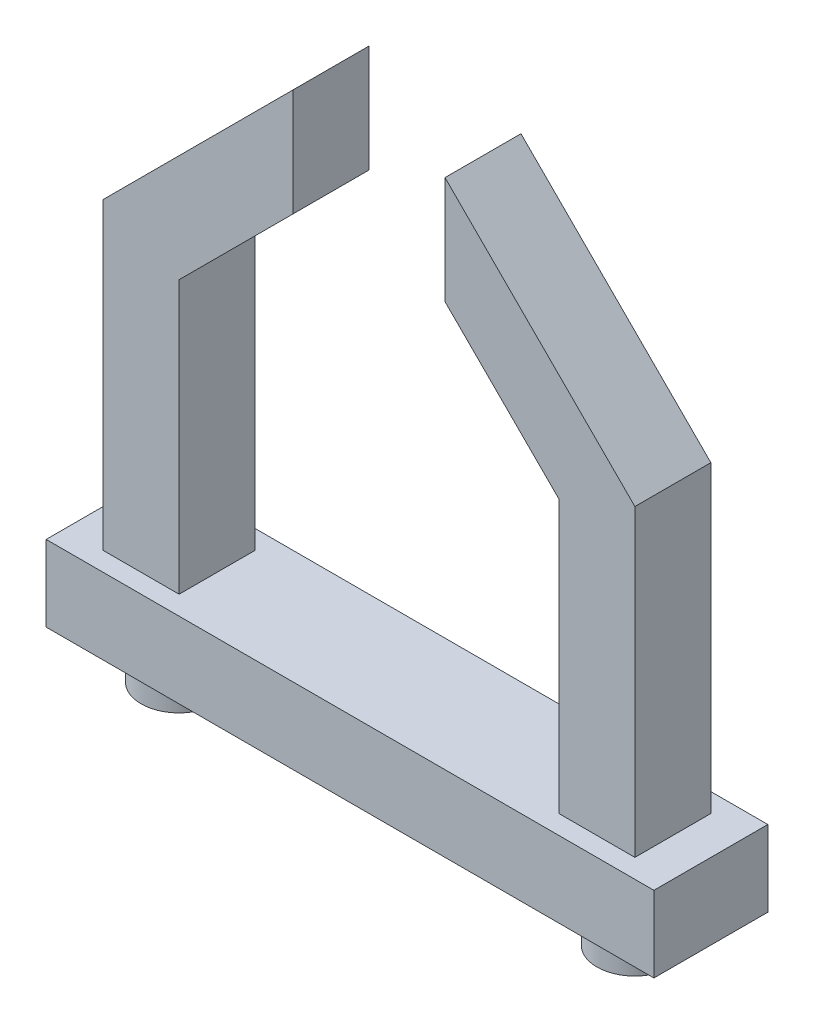
ISO-10303-21;
HEADER;
FILE_DESCRIPTION(('STEP AP214'),'2;1');
FILE_NAME('part.step','',(''),(''),'','','');
FILE_SCHEMA(('AUTOMOTIVE_DESIGN { 1 0 10303 214 1 1 1 1 }'));
ENDSEC;
DATA;
#1=APPLICATION_CONTEXT('core data for automotive mechanical design processes');
#2=APPLICATION_PROTOCOL_DEFINITION('international standard','automotive_design',2000,#1);
#3=PRODUCT_CONTEXT('',#1,'mechanical');
#4=PRODUCT('Part','Part','',(#3));
#5=PRODUCT_RELATED_PRODUCT_CATEGORY('part','',(#4));
#6=PRODUCT_DEFINITION_FORMATION('','',#4);
#7=PRODUCT_DEFINITION_CONTEXT('part definition',#1,'design');
#8=PRODUCT_DEFINITION('design','',#6,#7);
#9=PRODUCT_DEFINITION_SHAPE('','',#8);
#10=(LENGTH_UNIT() NAMED_UNIT(*) SI_UNIT(.MILLI.,.METRE.));
#11=(NAMED_UNIT(*) PLANE_ANGLE_UNIT() SI_UNIT($,.RADIAN.));
#12=(NAMED_UNIT(*) SI_UNIT($,.STERADIAN.) SOLID_ANGLE_UNIT());
#13=UNCERTAINTY_MEASURE_WITH_UNIT(LENGTH_MEASURE(1.E-05),#10,'distance_accuracy_value','');
#14=(GEOMETRIC_REPRESENTATION_CONTEXT(3) GLOBAL_UNCERTAINTY_ASSIGNED_CONTEXT((#13)) GLOBAL_UNIT_ASSIGNED_CONTEXT((#10,
#11,#12)) REPRESENTATION_CONTEXT('',''));
#15=CARTESIAN_POINT('',(0.,0.,0.));
#16=DIRECTION('',(0.,0.,1.));
#17=DIRECTION('',(1.,0.,0.));
#18=AXIS2_PLACEMENT_3D('',#15,#16,#17);
#19=CARTESIAN_POINT('',(-21.25,21.25,2.5));
#20=DIRECTION('',(-0.707106781186546,0.707106781186549,0.));
#21=DIRECTION('',(-0.707106781186549,-0.707106781186546,0.));
#22=AXIS2_PLACEMENT_3D('',#19,#20,#21);
#23=PLANE('',#22);
#24=DIRECTION('',(0.707106781186549,0.707106781186546,0.));
#25=VECTOR('',#24,1.);
#26=CARTESIAN_POINT('',(-21.25,21.25,-2.5));
#27=LINE('',#26,#25);
#28=CARTESIAN_POINT('',(-17.5,25.,-2.5));
#29=VERTEX_POINT('',#28);
#30=CARTESIAN_POINT('',(-5.,37.5,-2.5));
#31=VERTEX_POINT('',#30);
#32=EDGE_CURVE('E133',#29,#31,#27,.T.);
#33=ORIENTED_EDGE('',*,*,#32,.F.);
#34=DIRECTION('',(0.,0.,-1.));
#35=VECTOR('',#34,1.);
#36=CARTESIAN_POINT('',(-17.5,25.,2.5));
#37=LINE('',#36,#35);
#38=CARTESIAN_POINT('',(-17.5,25.,2.5));
#39=VERTEX_POINT('',#38);
#40=EDGE_CURVE('E55',#39,#29,#37,.T.);
#41=ORIENTED_EDGE('',*,*,#40,.F.);
#42=DIRECTION('',(0.707106781186549,0.707106781186546,0.));
#43=VECTOR('',#42,1.);
#44=CARTESIAN_POINT('',(-21.25,21.25,2.5));
#45=LINE('',#44,#43);
#46=CARTESIAN_POINT('',(-5.,37.5,2.5));
#47=VERTEX_POINT('',#46);
#48=EDGE_CURVE('E154',#39,#47,#45,.T.);
#49=ORIENTED_EDGE('',*,*,#48,.T.);
#50=DIRECTION('',(0.,0.,-1.));
#51=VECTOR('',#50,1.);
#52=CARTESIAN_POINT('',(-5.,37.5,2.5));
#53=LINE('',#52,#51);
#54=EDGE_CURVE('E63',#47,#31,#53,.T.);
#55=ORIENTED_EDGE('',*,*,#54,.T.);
#56=EDGE_LOOP('',(#33,#41,#49,#55));
#57=FACE_BOUND('',#56,.T.);
#58=ADVANCED_FACE('F46',(#57),#23,.T.);
#59=CARTESIAN_POINT('',(-17.5,0.,2.5));
#60=DIRECTION('',(1.,0.,0.));
#61=DIRECTION('',(0.,1.,0.));
#62=AXIS2_PLACEMENT_3D('',#59,#60,#61);
#63=PLANE('',#62);
#64=DIRECTION('',(0.,-1.,0.));
#65=VECTOR('',#64,1.);
#66=CARTESIAN_POINT('',(-17.5,0.,-2.5));
#67=LINE('',#66,#65);
#68=CARTESIAN_POINT('',(-17.5,5.,-2.5));
#69=VERTEX_POINT('',#68);
#70=EDGE_CURVE('E136',#29,#69,#67,.T.);
#71=ORIENTED_EDGE('',*,*,#70,.T.);
#72=DIRECTION('',(0.,0.,-1.));
#73=VECTOR('',#72,1.);
#74=CARTESIAN_POINT('',(-17.5,5.,2.5));
#75=LINE('',#74,#73);
#76=CARTESIAN_POINT('',(-17.5,5.,2.5));
#77=VERTEX_POINT('',#76);
#78=EDGE_CURVE('E161',#77,#69,#75,.T.);
#79=ORIENTED_EDGE('',*,*,#78,.F.);
#80=DIRECTION('',(0.,-1.,0.));
#81=VECTOR('',#80,1.);
#82=CARTESIAN_POINT('',(-17.5,0.,2.5));
#83=LINE('',#82,#81);
#84=EDGE_CURVE('E169',#39,#77,#83,.T.);
#85=ORIENTED_EDGE('',*,*,#84,.F.);
#86=ORIENTED_EDGE('',*,*,#40,.T.);
#87=EDGE_LOOP('',(#71,#79,#85,#86));
#88=FACE_BOUND('',#87,.T.);
#89=ADVANCED_FACE('F167',(#88),#63,.F.);
#90=CARTESIAN_POINT('',(-12.5,0.,2.5));
#91=DIRECTION('',(1.,0.,0.));
#92=DIRECTION('',(0.,1.,0.));
#93=AXIS2_PLACEMENT_3D('',#90,#91,#92);
#94=PLANE('',#93);
#95=DIRECTION('',(0.,-1.,0.));
#96=VECTOR('',#95,1.);
#97=CARTESIAN_POINT('',(-12.5,0.,-2.5));
#98=LINE('',#97,#96);
#99=CARTESIAN_POINT('',(-12.5,22.9289321881345,-2.5));
#100=VERTEX_POINT('',#99);
#101=CARTESIAN_POINT('',(-12.5,5.,-2.5));
#102=VERTEX_POINT('',#101);
#103=EDGE_CURVE('E108',#100,#102,#98,.T.);
#104=ORIENTED_EDGE('',*,*,#103,.F.);
#105=DIRECTION('',(0.,0.,-1.));
#106=VECTOR('',#105,1.);
#107=CARTESIAN_POINT('',(-12.5,22.9289321881345,2.5));
#108=LINE('',#107,#106);
#109=CARTESIAN_POINT('',(-12.5,22.9289321881345,2.5));
#110=VERTEX_POINT('',#109);
#111=EDGE_CURVE('E102',#110,#100,#108,.T.);
#112=ORIENTED_EDGE('',*,*,#111,.F.);
#113=DIRECTION('',(0.,-1.,0.));
#114=VECTOR('',#113,1.);
#115=CARTESIAN_POINT('',(-12.5,0.,2.5));
#116=LINE('',#115,#114);
#117=CARTESIAN_POINT('',(-12.5,5.,2.5));
#118=VERTEX_POINT('',#117);
#119=EDGE_CURVE('E105',#110,#118,#116,.T.);
#120=ORIENTED_EDGE('',*,*,#119,.T.);
#121=DIRECTION('',(0.,0.,-1.));
#122=VECTOR('',#121,1.);
#123=CARTESIAN_POINT('',(-12.5,5.,2.5));
#124=LINE('',#123,#122);
#125=EDGE_CURVE('E113',#118,#102,#124,.T.);
#126=ORIENTED_EDGE('',*,*,#125,.T.);
#127=EDGE_LOOP('',(#104,#112,#120,#126));
#128=FACE_BOUND('',#127,.T.);
#129=ADVANCED_FACE('F104',(#128),#94,.T.);
#130=CARTESIAN_POINT('',(-17.7144660940672,17.7144660940673,2.5));
#131=DIRECTION('',(0.707106781186546,-0.707106781186549,0.));
#132=DIRECTION('',(0.707106781186549,0.707106781186546,0.));
#133=AXIS2_PLACEMENT_3D('',#130,#131,#132);
#134=PLANE('',#133);
#135=DIRECTION('',(-0.707106781186549,-0.707106781186546,0.));
#136=VECTOR('',#135,1.);
#137=CARTESIAN_POINT('',(-17.7144660940672,17.7144660940673,-2.5));
#138=LINE('',#137,#136);
#139=CARTESIAN_POINT('',(-5.,30.4289321881345,-2.5));
#140=VERTEX_POINT('',#139);
#141=EDGE_CURVE('E147',#140,#100,#138,.T.);
#142=ORIENTED_EDGE('',*,*,#141,.F.);
#143=DIRECTION('',(0.,0.,-1.));
#144=VECTOR('',#143,1.);
#145=CARTESIAN_POINT('',(-5.,30.4289321881345,2.5));
#146=LINE('',#145,#144);
#147=CARTESIAN_POINT('',(-5.,30.4289321881345,2.5));
#148=VERTEX_POINT('',#147);
#149=EDGE_CURVE('E81',#148,#140,#146,.T.);
#150=ORIENTED_EDGE('',*,*,#149,.F.);
#151=DIRECTION('',(-0.707106781186549,-0.707106781186546,0.));
#152=VECTOR('',#151,1.);
#153=CARTESIAN_POINT('',(-17.7144660940672,17.7144660940673,2.5));
#154=LINE('',#153,#152);
#155=EDGE_CURVE('E120',#148,#110,#154,.T.);
#156=ORIENTED_EDGE('',*,*,#155,.T.);
#157=ORIENTED_EDGE('',*,*,#111,.T.);
#158=EDGE_LOOP('',(#142,#150,#156,#157));
#159=FACE_BOUND('',#158,.T.);
#160=ADVANCED_FACE('F125',(#159),#134,.T.);
#161=CARTESIAN_POINT('',(-4.99999999999998,0.,2.5));
#162=DIRECTION('',(1.,0.,0.));
#163=DIRECTION('',(0.,1.,0.));
#164=AXIS2_PLACEMENT_3D('',#161,#162,#163);
#165=PLANE('',#164);
#166=DIRECTION('',(0.,-1.,0.));
#167=VECTOR('',#166,1.);
#168=CARTESIAN_POINT('',(-4.99999999999998,0.,-2.5));
#169=LINE('',#168,#167);
#170=EDGE_CURVE('E150',#31,#140,#169,.T.);
#171=ORIENTED_EDGE('',*,*,#170,.F.);
#172=ORIENTED_EDGE('',*,*,#54,.F.);
#173=DIRECTION('',(0.,-1.,0.));
#174=VECTOR('',#173,1.);
#175=CARTESIAN_POINT('',(-4.99999999999998,0.,2.5));
#176=LINE('',#175,#174);
#177=EDGE_CURVE('E127',#47,#148,#176,.T.);
#178=ORIENTED_EDGE('',*,*,#177,.T.);
#179=ORIENTED_EDGE('',*,*,#149,.T.);
#180=EDGE_LOOP('',(#171,#172,#178,#179));
#181=FACE_BOUND('',#180,.T.);
#182=ADVANCED_FACE('F185',(#181),#165,.T.);
#183=CARTESIAN_POINT('',(0.,0.,2.5));
#184=DIRECTION('',(0.,0.,1.));
#185=DIRECTION('',(1.,0.,0.));
#186=AXIS2_PLACEMENT_3D('',#183,#184,#185);
#187=PLANE('',#186);
#188=ORIENTED_EDGE('',*,*,#48,.F.);
#189=ORIENTED_EDGE('',*,*,#84,.T.);
#190=DIRECTION('',(-1.,0.,0.));
#191=VECTOR('',#190,1.);
#192=CARTESIAN_POINT('',(0.,5.,2.5));
#193=LINE('',#192,#191);
#194=EDGE_CURVE('E122',#118,#77,#193,.T.);
#195=ORIENTED_EDGE('',*,*,#194,.F.);
#196=ORIENTED_EDGE('',*,*,#119,.F.);
#197=ORIENTED_EDGE('',*,*,#155,.F.);
#198=ORIENTED_EDGE('',*,*,#177,.F.);
#199=EDGE_LOOP('',(#188,#189,#195,#196,#197,#198));
#200=FACE_BOUND('',#199,.T.);
#201=ADVANCED_FACE('F118',(#200),#187,.T.);
#202=CARTESIAN_POINT('',(0.,0.,-2.5));
#203=DIRECTION('',(0.,0.,1.));
#204=DIRECTION('',(1.,0.,0.));
#205=AXIS2_PLACEMENT_3D('',#202,#203,#204);
#206=PLANE('',#205);
#207=ORIENTED_EDGE('',*,*,#32,.T.);
#208=ORIENTED_EDGE('',*,*,#170,.T.);
#209=ORIENTED_EDGE('',*,*,#141,.T.);
#210=ORIENTED_EDGE('',*,*,#103,.T.);
#211=DIRECTION('',(-1.,0.,0.));
#212=VECTOR('',#211,1.);
#213=CARTESIAN_POINT('',(0.,5.,-2.5));
#214=LINE('',#213,#212);
#215=EDGE_CURVE('E141',#102,#69,#214,.T.);
#216=ORIENTED_EDGE('',*,*,#215,.T.);
#217=ORIENTED_EDGE('',*,*,#70,.F.);
#218=EDGE_LOOP('',(#207,#208,#209,#210,#216,#217));
#219=FACE_BOUND('',#218,.T.);
#220=ADVANCED_FACE('F171',(#219),#206,.F.);
#221=CARTESIAN_POINT('',(0.,5.,3.75));
#222=DIRECTION('',(0.,-1.,0.));
#223=DIRECTION('',(0.,0.,-1.));
#224=AXIS2_PLACEMENT_3D('',#221,#222,#223);
#225=PLANE('',#224);
#226=ORIENTED_EDGE('',*,*,#215,.F.);
#227=ORIENTED_EDGE('',*,*,#125,.F.);
#228=ORIENTED_EDGE('',*,*,#194,.T.);
#229=ORIENTED_EDGE('',*,*,#78,.T.);
#230=EDGE_LOOP('',(#226,#227,#228,#229));
#231=FACE_BOUND('',#230,.T.);
#232=DIRECTION('',(-1.,0.,0.));
#233=VECTOR('',#232,1.);
#234=CARTESIAN_POINT('',(0.,5.,-3.75));
#235=LINE('',#234,#233);
#236=CARTESIAN_POINT('',(20.,5.,-3.75));
#237=VERTEX_POINT('',#236);
#238=CARTESIAN_POINT('',(-20.,5.,-3.75));
#239=VERTEX_POINT('',#238);
#240=EDGE_CURVE('E362',#237,#239,#235,.T.);
#241=ORIENTED_EDGE('',*,*,#240,.T.);
#242=DIRECTION('',(0.,0.,-1.));
#243=VECTOR('',#242,1.);
#244=CARTESIAN_POINT('',(-20.,5.,3.75));
#245=LINE('',#244,#243);
#246=CARTESIAN_POINT('',(-20.,5.,3.75));
#247=VERTEX_POINT('',#246);
#248=EDGE_CURVE('E137',#247,#239,#245,.T.);
#249=ORIENTED_EDGE('',*,*,#248,.F.);
#250=DIRECTION('',(-1.,0.,0.));
#251=VECTOR('',#250,1.);
#252=CARTESIAN_POINT('',(0.,5.,3.75));
#253=LINE('',#252,#251);
#254=CARTESIAN_POINT('',(20.,5.,3.75));
#255=VERTEX_POINT('',#254);
#256=EDGE_CURVE('E363',#255,#247,#253,.T.);
#257=ORIENTED_EDGE('',*,*,#256,.F.);
#258=DIRECTION('',(0.,0.,-1.));
#259=VECTOR('',#258,1.);
#260=CARTESIAN_POINT('',(20.,5.,3.75));
#261=LINE('',#260,#259);
#262=EDGE_CURVE('E278',#255,#237,#261,.T.);
#263=ORIENTED_EDGE('',*,*,#262,.T.);
#264=EDGE_LOOP('',(#241,#249,#257,#263));
#265=FACE_BOUND('',#264,.T.);
#266=DIRECTION('',(1.,0.,0.));
#267=VECTOR('',#266,1.);
#268=CARTESIAN_POINT('',(0.,5.,-2.5));
#269=LINE('',#268,#267);
#270=CARTESIAN_POINT('',(12.5,5.,-2.5));
#271=VERTEX_POINT('',#270);
#272=CARTESIAN_POINT('',(17.5,5.,-2.5));
#273=VERTEX_POINT('',#272);
#274=EDGE_CURVE('E316',#271,#273,#269,.T.);
#275=ORIENTED_EDGE('',*,*,#274,.T.);
#276=DIRECTION('',(0.,0.,-1.));
#277=VECTOR('',#276,1.);
#278=CARTESIAN_POINT('',(17.5,5.,2.5));
#279=LINE('',#278,#277);
#280=CARTESIAN_POINT('',(17.5,5.,2.5));
#281=VERTEX_POINT('',#280);
#282=EDGE_CURVE('E346',#281,#273,#279,.T.);
#283=ORIENTED_EDGE('',*,*,#282,.F.);
#284=DIRECTION('',(1.,0.,0.));
#285=VECTOR('',#284,1.);
#286=CARTESIAN_POINT('',(0.,5.,2.5));
#287=LINE('',#286,#285);
#288=CARTESIAN_POINT('',(12.5,5.,2.5));
#289=VERTEX_POINT('',#288);
#290=EDGE_CURVE('E292',#289,#281,#287,.T.);
#291=ORIENTED_EDGE('',*,*,#290,.F.);
#292=DIRECTION('',(0.,0.,-1.));
#293=VECTOR('',#292,1.);
#294=CARTESIAN_POINT('',(12.5,5.,2.5));
#295=LINE('',#294,#293);
#296=EDGE_CURVE('E342',#289,#271,#295,.T.);
#297=ORIENTED_EDGE('',*,*,#296,.T.);
#298=EDGE_LOOP('',(#275,#283,#291,#297));
#299=FACE_BOUND('',#298,.T.);
#300=ADVANCED_FACE('F189',(#231,#265,#299),#225,.F.);
#301=CARTESIAN_POINT('',(-20.,0.,3.75));
#302=DIRECTION('',(1.,0.,0.));
#303=DIRECTION('',(0.,0.,-1.));
#304=AXIS2_PLACEMENT_3D('',#301,#302,#303);
#305=PLANE('',#304);
#306=DIRECTION('',(0.,-1.,0.));
#307=VECTOR('',#306,1.);
#308=CARTESIAN_POINT('',(-20.,0.,-3.75));
#309=LINE('',#308,#307);
#310=CARTESIAN_POINT('',(-20.,0.,-3.75));
#311=VERTEX_POINT('',#310);
#312=EDGE_CURVE('E380',#239,#311,#309,.T.);
#313=ORIENTED_EDGE('',*,*,#312,.T.);
#314=DIRECTION('',(0.,0.,-1.));
#315=VECTOR('',#314,1.);
#316=CARTESIAN_POINT('',(-20.,0.,3.75));
#317=LINE('',#316,#315);
#318=CARTESIAN_POINT('',(-20.,0.,3.75));
#319=VERTEX_POINT('',#318);
#320=EDGE_CURVE('E376',#319,#311,#317,.T.);
#321=ORIENTED_EDGE('',*,*,#320,.F.);
#322=DIRECTION('',(0.,-1.,0.));
#323=VECTOR('',#322,1.);
#324=CARTESIAN_POINT('',(-20.,0.,3.75));
#325=LINE('',#324,#323);
#326=EDGE_CURVE('E367',#247,#319,#325,.T.);
#327=ORIENTED_EDGE('',*,*,#326,.F.);
#328=ORIENTED_EDGE('',*,*,#248,.T.);
#329=EDGE_LOOP('',(#313,#321,#327,#328));
#330=FACE_BOUND('',#329,.T.);
#331=ADVANCED_FACE('F194',(#330),#305,.F.);
#332=CARTESIAN_POINT('',(0.,0.,3.75));
#333=DIRECTION('',(0.,1.,0.));
#334=DIRECTION('',(0.,0.,1.));
#335=AXIS2_PLACEMENT_3D('',#332,#333,#334);
#336=PLANE('',#335);
#337=CARTESIAN_POINT('',(-15.,0.,0.));
#338=DIRECTION('',(0.,1.,0.));
#339=DIRECTION('',(0.,0.,1.));
#340=AXIS2_PLACEMENT_3D('',#337,#338,#339);
#341=CIRCLE('',#340,2.5);
#342=CARTESIAN_POINT('',(-15.,0.,2.5));
#343=VERTEX_POINT('',#342);
#344=EDGE_CURVE('E11',#343,#343,#341,.F.);
#345=ORIENTED_EDGE('',*,*,#344,.F.);
#346=EDGE_LOOP('',(#345));
#347=FACE_BOUND('',#346,.T.);
#348=DIRECTION('',(1.,0.,0.));
#349=VECTOR('',#348,1.);
#350=CARTESIAN_POINT('',(0.,0.,-3.75));
#351=LINE('',#350,#349);
#352=CARTESIAN_POINT('',(20.,0.,-3.75));
#353=VERTEX_POINT('',#352);
#354=EDGE_CURVE('E368',#311,#353,#351,.T.);
#355=ORIENTED_EDGE('',*,*,#354,.T.);
#356=DIRECTION('',(0.,0.,-1.));
#357=VECTOR('',#356,1.);
#358=CARTESIAN_POINT('',(20.,0.,3.75));
#359=LINE('',#358,#357);
#360=CARTESIAN_POINT('',(20.,0.,3.75));
#361=VERTEX_POINT('',#360);
#362=EDGE_CURVE('E273',#361,#353,#359,.T.);
#363=ORIENTED_EDGE('',*,*,#362,.F.);
#364=DIRECTION('',(1.,0.,0.));
#365=VECTOR('',#364,1.);
#366=CARTESIAN_POINT('',(0.,0.,3.75));
#367=LINE('',#366,#365);
#368=EDGE_CURVE('E372',#319,#361,#367,.T.);
#369=ORIENTED_EDGE('',*,*,#368,.F.);
#370=ORIENTED_EDGE('',*,*,#320,.T.);
#371=EDGE_LOOP('',(#355,#363,#369,#370));
#372=FACE_BOUND('',#371,.T.);
#373=CARTESIAN_POINT('',(15.,0.,0.));
#374=DIRECTION('',(0.,-1.,0.));
#375=DIRECTION('',(0.,0.,1.));
#376=AXIS2_PLACEMENT_3D('',#373,#374,#375);
#377=CIRCLE('',#376,2.5);
#378=CARTESIAN_POINT('',(15.,0.,2.5));
#379=VERTEX_POINT('',#378);
#380=EDGE_CURVE('E354',#379,#379,#377,.F.);
#381=ORIENTED_EDGE('',*,*,#380,.T.);
#382=EDGE_LOOP('',(#381));
#383=FACE_BOUND('',#382,.T.);
#384=ADVANCED_FACE('F198',(#347,#372,#383),#336,.F.);
#385=CARTESIAN_POINT('',(0.,0.,3.75));
#386=DIRECTION('',(0.,0.,1.));
#387=DIRECTION('',(1.,0.,0.));
#388=AXIS2_PLACEMENT_3D('',#385,#386,#387);
#389=PLANE('',#388);
#390=ORIENTED_EDGE('',*,*,#256,.T.);
#391=ORIENTED_EDGE('',*,*,#326,.T.);
#392=ORIENTED_EDGE('',*,*,#368,.T.);
#393=DIRECTION('',(0.,-1.,0.));
#394=VECTOR('',#393,1.);
#395=CARTESIAN_POINT('',(20.,0.,3.75));
#396=LINE('',#395,#394);
#397=EDGE_CURVE('E268',#255,#361,#396,.T.);
#398=ORIENTED_EDGE('',*,*,#397,.F.);
#399=EDGE_LOOP('',(#390,#391,#392,#398));
#400=FACE_BOUND('',#399,.T.);
#401=ADVANCED_FACE('F202',(#400),#389,.T.);
#402=CARTESIAN_POINT('',(0.,0.,-3.75));
#403=DIRECTION('',(0.,0.,1.));
#404=DIRECTION('',(1.,0.,0.));
#405=AXIS2_PLACEMENT_3D('',#402,#403,#404);
#406=PLANE('',#405);
#407=ORIENTED_EDGE('',*,*,#240,.F.);
#408=DIRECTION('',(0.,-1.,0.));
#409=VECTOR('',#408,1.);
#410=CARTESIAN_POINT('',(20.,0.,-3.75));
#411=LINE('',#410,#409);
#412=EDGE_CURVE('E264',#237,#353,#411,.T.);
#413=ORIENTED_EDGE('',*,*,#412,.T.);
#414=ORIENTED_EDGE('',*,*,#354,.F.);
#415=ORIENTED_EDGE('',*,*,#312,.F.);
#416=EDGE_LOOP('',(#407,#413,#414,#415));
#417=FACE_BOUND('',#416,.T.);
#418=ADVANCED_FACE('F204',(#417),#406,.F.);
#419=CARTESIAN_POINT('',(-15.,-2.5,0.));
#420=DIRECTION('',(0.,1.,0.));
#421=DIRECTION('',(0.,0.,1.));
#422=AXIS2_PLACEMENT_3D('',#419,#420,#421);
#423=CYLINDRICAL_SURFACE('',#422,2.5);
#424=CARTESIAN_POINT('',(-15.,-2.5,0.));
#425=DIRECTION('',(0.,-1.,0.));
#426=DIRECTION('',(0.,0.,-1.));
#427=AXIS2_PLACEMENT_3D('',#424,#425,#426);
#428=CIRCLE('',#427,2.5);
#429=CARTESIAN_POINT('',(-15.,-2.5,-2.5));
#430=VERTEX_POINT('',#429);
#431=EDGE_CURVE('E358',#430,#430,#428,.T.);
#432=ORIENTED_EDGE('',*,*,#431,.F.);
#433=EDGE_LOOP('',(#432));
#434=FACE_BOUND('',#433,.T.);
#435=ORIENTED_EDGE('',*,*,#344,.T.);
#436=EDGE_LOOP('',(#435));
#437=FACE_BOUND('',#436,.T.);
#438=ADVANCED_FACE('F207',(#434,#437),#423,.T.);
#439=CARTESIAN_POINT('',(-15.,-2.5,0.));
#440=DIRECTION('',(0.,-1.,0.));
#441=DIRECTION('',(0.,0.,-1.));
#442=AXIS2_PLACEMENT_3D('',#439,#440,#441);
#443=PLANE('',#442);
#444=ORIENTED_EDGE('',*,*,#431,.T.);
#445=EDGE_LOOP('',(#444));
#446=FACE_BOUND('',#445,.T.);
#447=ADVANCED_FACE('F214',(#446),#443,.T.);
#448=CARTESIAN_POINT('',(21.25,21.25,2.5));
#449=DIRECTION('',(0.707106781186546,0.707106781186549,0.));
#450=DIRECTION('',(0.707106781186549,-0.707106781186546,0.));
#451=AXIS2_PLACEMENT_3D('',#448,#449,#450);
#452=PLANE('',#451);
#453=DIRECTION('',(-0.707106781186549,0.707106781186546,0.));
#454=VECTOR('',#453,1.);
#455=CARTESIAN_POINT('',(21.25,21.25,-2.5));
#456=LINE('',#455,#454);
#457=CARTESIAN_POINT('',(17.5,25.,-2.5));
#458=VERTEX_POINT('',#457);
#459=CARTESIAN_POINT('',(5.,37.5,-2.5));
#460=VERTEX_POINT('',#459);
#461=EDGE_CURVE('E282',#458,#460,#456,.T.);
#462=ORIENTED_EDGE('',*,*,#461,.T.);
#463=DIRECTION('',(0.,0.,-1.));
#464=VECTOR('',#463,1.);
#465=CARTESIAN_POINT('',(5.,37.5,2.5));
#466=LINE('',#465,#464);
#467=CARTESIAN_POINT('',(5.,37.5,2.5));
#468=VERTEX_POINT('',#467);
#469=EDGE_CURVE('E308',#468,#460,#466,.T.);
#470=ORIENTED_EDGE('',*,*,#469,.F.);
#471=DIRECTION('',(-0.707106781186549,0.707106781186546,0.));
#472=VECTOR('',#471,1.);
#473=CARTESIAN_POINT('',(21.25,21.25,2.5));
#474=LINE('',#473,#472);
#475=CARTESIAN_POINT('',(17.5,25.,2.5));
#476=VERTEX_POINT('',#475);
#477=EDGE_CURVE('E283',#476,#468,#474,.T.);
#478=ORIENTED_EDGE('',*,*,#477,.F.);
#479=DIRECTION('',(0.,0.,-1.));
#480=VECTOR('',#479,1.);
#481=CARTESIAN_POINT('',(17.5,25.,2.5));
#482=LINE('',#481,#480);
#483=EDGE_CURVE('E350',#476,#458,#482,.T.);
#484=ORIENTED_EDGE('',*,*,#483,.T.);
#485=EDGE_LOOP('',(#462,#470,#478,#484));
#486=FACE_BOUND('',#485,.T.);
#487=ADVANCED_FACE('F218',(#486),#452,.T.);
#488=CARTESIAN_POINT('',(17.5,0.,2.5));
#489=DIRECTION('',(-1.,0.,0.));
#490=DIRECTION('',(0.,1.,0.));
#491=AXIS2_PLACEMENT_3D('',#488,#489,#490);
#492=PLANE('',#491);
#493=DIRECTION('',(0.,-1.,0.));
#494=VECTOR('',#493,1.);
#495=CARTESIAN_POINT('',(17.5,0.,-2.5));
#496=LINE('',#495,#494);
#497=EDGE_CURVE('E312',#458,#273,#496,.T.);
#498=ORIENTED_EDGE('',*,*,#497,.F.);
#499=ORIENTED_EDGE('',*,*,#483,.F.);
#500=DIRECTION('',(0.,-1.,0.));
#501=VECTOR('',#500,1.);
#502=CARTESIAN_POINT('',(17.5,0.,2.5));
#503=LINE('',#502,#501);
#504=EDGE_CURVE('E287',#476,#281,#503,.T.);
#505=ORIENTED_EDGE('',*,*,#504,.T.);
#506=ORIENTED_EDGE('',*,*,#282,.T.);
#507=EDGE_LOOP('',(#498,#499,#505,#506));
#508=FACE_BOUND('',#507,.T.);
#509=ADVANCED_FACE('F222',(#508),#492,.F.);
#510=CARTESIAN_POINT('',(12.5,0.,2.5));
#511=DIRECTION('',(-1.,0.,0.));
#512=DIRECTION('',(0.,1.,0.));
#513=AXIS2_PLACEMENT_3D('',#510,#511,#512);
#514=PLANE('',#513);
#515=DIRECTION('',(0.,-1.,0.));
#516=VECTOR('',#515,1.);
#517=CARTESIAN_POINT('',(12.5,0.,-2.5));
#518=LINE('',#517,#516);
#519=CARTESIAN_POINT('',(12.5,22.9289321881345,-2.5));
#520=VERTEX_POINT('',#519);
#521=EDGE_CURVE('E320',#520,#271,#518,.T.);
#522=ORIENTED_EDGE('',*,*,#521,.T.);
#523=ORIENTED_EDGE('',*,*,#296,.F.);
#524=DIRECTION('',(0.,-1.,0.));
#525=VECTOR('',#524,1.);
#526=CARTESIAN_POINT('',(12.5,0.,2.5));
#527=LINE('',#526,#525);
#528=CARTESIAN_POINT('',(12.5,22.9289321881345,2.5));
#529=VERTEX_POINT('',#528);
#530=EDGE_CURVE('E296',#529,#289,#527,.T.);
#531=ORIENTED_EDGE('',*,*,#530,.F.);
#532=DIRECTION('',(0.,0.,-1.));
#533=VECTOR('',#532,1.);
#534=CARTESIAN_POINT('',(12.5,22.9289321881345,2.5));
#535=LINE('',#534,#533);
#536=EDGE_CURVE('E338',#529,#520,#535,.T.);
#537=ORIENTED_EDGE('',*,*,#536,.T.);
#538=EDGE_LOOP('',(#522,#523,#531,#537));
#539=FACE_BOUND('',#538,.T.);
#540=ADVANCED_FACE('F226',(#539),#514,.T.);
#541=CARTESIAN_POINT('',(17.7144660940672,17.7144660940673,2.5));
#542=DIRECTION('',(-0.707106781186546,-0.707106781186549,0.));
#543=DIRECTION('',(-0.707106781186549,0.707106781186546,0.));
#544=AXIS2_PLACEMENT_3D('',#541,#542,#543);
#545=PLANE('',#544);
#546=DIRECTION('',(0.707106781186549,-0.707106781186546,0.));
#547=VECTOR('',#546,1.);
#548=CARTESIAN_POINT('',(17.7144660940672,17.7144660940673,-2.5));
#549=LINE('',#548,#547);
#550=CARTESIAN_POINT('',(5.,30.4289321881345,-2.5));
#551=VERTEX_POINT('',#550);
#552=EDGE_CURVE('E324',#551,#520,#549,.T.);
#553=ORIENTED_EDGE('',*,*,#552,.T.);
#554=ORIENTED_EDGE('',*,*,#536,.F.);
#555=DIRECTION('',(0.707106781186549,-0.707106781186546,0.));
#556=VECTOR('',#555,1.);
#557=CARTESIAN_POINT('',(17.7144660940672,17.7144660940673,2.5));
#558=LINE('',#557,#556);
#559=CARTESIAN_POINT('',(5.,30.4289321881345,2.5));
#560=VERTEX_POINT('',#559);
#561=EDGE_CURVE('E300',#560,#529,#558,.T.);
#562=ORIENTED_EDGE('',*,*,#561,.F.);
#563=DIRECTION('',(0.,0.,-1.));
#564=VECTOR('',#563,1.);
#565=CARTESIAN_POINT('',(5.,30.4289321881345,2.5));
#566=LINE('',#565,#564);
#567=EDGE_CURVE('E334',#560,#551,#566,.T.);
#568=ORIENTED_EDGE('',*,*,#567,.T.);
#569=EDGE_LOOP('',(#553,#554,#562,#568));
#570=FACE_BOUND('',#569,.T.);
#571=ADVANCED_FACE('F230',(#570),#545,.T.);
#572=CARTESIAN_POINT('',(4.99999999999998,0.,2.5));
#573=DIRECTION('',(-1.,0.,0.));
#574=DIRECTION('',(0.,1.,0.));
#575=AXIS2_PLACEMENT_3D('',#572,#573,#574);
#576=PLANE('',#575);
#577=DIRECTION('',(0.,-1.,0.));
#578=VECTOR('',#577,1.);
#579=CARTESIAN_POINT('',(4.99999999999998,0.,-2.5));
#580=LINE('',#579,#578);
#581=EDGE_CURVE('E288',#460,#551,#580,.T.);
#582=ORIENTED_EDGE('',*,*,#581,.T.);
#583=ORIENTED_EDGE('',*,*,#567,.F.);
#584=DIRECTION('',(0.,-1.,0.));
#585=VECTOR('',#584,1.);
#586=CARTESIAN_POINT('',(4.99999999999998,0.,2.5));
#587=LINE('',#586,#585);
#588=EDGE_CURVE('E304',#468,#560,#587,.T.);
#589=ORIENTED_EDGE('',*,*,#588,.F.);
#590=ORIENTED_EDGE('',*,*,#469,.T.);
#591=EDGE_LOOP('',(#582,#583,#589,#590));
#592=FACE_BOUND('',#591,.T.);
#593=ADVANCED_FACE('F234',(#592),#576,.T.);
#594=CARTESIAN_POINT('',(0.,0.,2.5));
#595=DIRECTION('',(0.,0.,1.));
#596=DIRECTION('',(-1.,0.,0.));
#597=AXIS2_PLACEMENT_3D('',#594,#595,#596);
#598=PLANE('',#597);
#599=ORIENTED_EDGE('',*,*,#477,.T.);
#600=ORIENTED_EDGE('',*,*,#588,.T.);
#601=ORIENTED_EDGE('',*,*,#561,.T.);
#602=ORIENTED_EDGE('',*,*,#530,.T.);
#603=ORIENTED_EDGE('',*,*,#290,.T.);
#604=ORIENTED_EDGE('',*,*,#504,.F.);
#605=EDGE_LOOP('',(#599,#600,#601,#602,#603,#604));
#606=FACE_BOUND('',#605,.T.);
#607=ADVANCED_FACE('F238',(#606),#598,.T.);
#608=CARTESIAN_POINT('',(0.,0.,-2.5));
#609=DIRECTION('',(0.,0.,1.));
#610=DIRECTION('',(-1.,0.,0.));
#611=AXIS2_PLACEMENT_3D('',#608,#609,#610);
#612=PLANE('',#611);
#613=ORIENTED_EDGE('',*,*,#461,.F.);
#614=ORIENTED_EDGE('',*,*,#497,.T.);
#615=ORIENTED_EDGE('',*,*,#274,.F.);
#616=ORIENTED_EDGE('',*,*,#521,.F.);
#617=ORIENTED_EDGE('',*,*,#552,.F.);
#618=ORIENTED_EDGE('',*,*,#581,.F.);
#619=EDGE_LOOP('',(#613,#614,#615,#616,#617,#618));
#620=FACE_BOUND('',#619,.T.);
#621=ADVANCED_FACE('F240',(#620),#612,.F.);
#622=CARTESIAN_POINT('',(20.,0.,3.75));
#623=DIRECTION('',(-1.,0.,0.));
#624=DIRECTION('',(0.,0.,-1.));
#625=AXIS2_PLACEMENT_3D('',#622,#623,#624);
#626=PLANE('',#625);
#627=ORIENTED_EDGE('',*,*,#412,.F.);
#628=ORIENTED_EDGE('',*,*,#262,.F.);
#629=ORIENTED_EDGE('',*,*,#397,.T.);
#630=ORIENTED_EDGE('',*,*,#362,.T.);
#631=EDGE_LOOP('',(#627,#628,#629,#630));
#632=FACE_BOUND('',#631,.T.);
#633=ADVANCED_FACE('F243',(#632),#626,.F.);
#634=CARTESIAN_POINT('',(15.,-2.5,0.));
#635=DIRECTION('',(0.,1.,0.));
#636=DIRECTION('',(0.,0.,1.));
#637=AXIS2_PLACEMENT_3D('',#634,#635,#636);
#638=CYLINDRICAL_SURFACE('',#637,2.5);
#639=CARTESIAN_POINT('',(15.,-2.5,0.));
#640=DIRECTION('',(0.,1.,0.));
#641=DIRECTION('',(0.,0.,-1.));
#642=AXIS2_PLACEMENT_3D('',#639,#640,#641);
#643=CIRCLE('',#642,2.5);
#644=CARTESIAN_POINT('',(15.,-2.5,-2.5));
#645=VERTEX_POINT('',#644);
#646=EDGE_CURVE('E262',#645,#645,#643,.T.);
#647=ORIENTED_EDGE('',*,*,#646,.T.);
#648=EDGE_LOOP('',(#647));
#649=FACE_BOUND('',#648,.T.);
#650=ORIENTED_EDGE('',*,*,#380,.F.);
#651=EDGE_LOOP('',(#650));
#652=FACE_BOUND('',#651,.T.);
#653=ADVANCED_FACE('F250',(#649,#652),#638,.T.);
#654=CARTESIAN_POINT('',(15.,-2.5,0.));
#655=DIRECTION('',(0.,-1.,0.));
#656=DIRECTION('',(0.,0.,-1.));
#657=AXIS2_PLACEMENT_3D('',#654,#655,#656);
#658=PLANE('',#657);
#659=ORIENTED_EDGE('',*,*,#646,.F.);
#660=EDGE_LOOP('',(#659));
#661=FACE_BOUND('',#660,.T.);
#662=ADVANCED_FACE('F254',(#661),#658,.T.);
#663=CLOSED_SHELL('',(#58,#89,#129,#160,#182,#201,#220,#300,#331,#384,#401,#418,#438,#447,#487,
#509,#540,#571,#593,#607,#621,#633,#653,#662));
#664=MANIFOLD_SOLID_BREP('B2',#663);
#665=ADVANCED_BREP_SHAPE_REPRESENTATION('',(#18,#664),#14);
#666=SHAPE_DEFINITION_REPRESENTATION(#9,#665);
ENDSEC;
END-ISO-10303-21;
